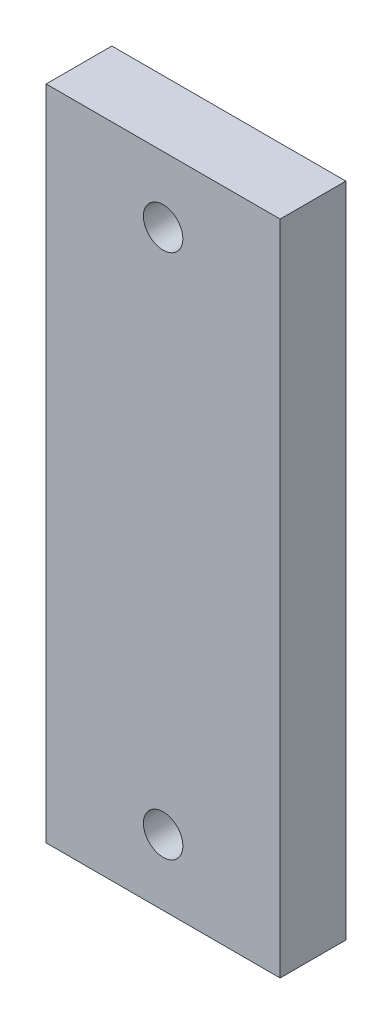
ISO-10303-21;
HEADER;
FILE_DESCRIPTION(('STEP AP214'),'2;1');
FILE_NAME('part.step','',(''),(''),'','','');
FILE_SCHEMA(('AUTOMOTIVE_DESIGN { 1 0 10303 214 1 1 1 1 }'));
ENDSEC;
DATA;
#1=APPLICATION_CONTEXT('core data for automotive mechanical design processes');
#2=APPLICATION_PROTOCOL_DEFINITION('international standard','automotive_design',2000,#1);
#3=PRODUCT_CONTEXT('',#1,'mechanical');
#4=PRODUCT('Part','Part','',(#3));
#5=PRODUCT_RELATED_PRODUCT_CATEGORY('part','',(#4));
#6=PRODUCT_DEFINITION_FORMATION('','',#4);
#7=PRODUCT_DEFINITION_CONTEXT('part definition',#1,'design');
#8=PRODUCT_DEFINITION('design','',#6,#7);
#9=PRODUCT_DEFINITION_SHAPE('','',#8);
#10=(LENGTH_UNIT() NAMED_UNIT(*) SI_UNIT(.MILLI.,.METRE.));
#11=(NAMED_UNIT(*) PLANE_ANGLE_UNIT() SI_UNIT($,.RADIAN.));
#12=(NAMED_UNIT(*) SI_UNIT($,.STERADIAN.) SOLID_ANGLE_UNIT());
#13=UNCERTAINTY_MEASURE_WITH_UNIT(LENGTH_MEASURE(1.E-05),#10,'distance_accuracy_value','');
#14=(GEOMETRIC_REPRESENTATION_CONTEXT(3) GLOBAL_UNCERTAINTY_ASSIGNED_CONTEXT((#13)) GLOBAL_UNIT_ASSIGNED_CONTEXT((#10,
#11,#12)) REPRESENTATION_CONTEXT('',''));
#15=CARTESIAN_POINT('',(0.,0.,0.));
#16=DIRECTION('',(0.,0.,1.));
#17=DIRECTION('',(1.,0.,0.));
#18=AXIS2_PLACEMENT_3D('',#15,#16,#17);
#19=CARTESIAN_POINT('',(0.,0.,5.));
#20=DIRECTION('',(0.,0.,-1.));
#21=DIRECTION('',(-1.,0.,0.));
#22=AXIS2_PLACEMENT_3D('',#19,#20,#21);
#23=PLANE('',#22);
#24=DIRECTION('',(0.,1.,0.));
#25=VECTOR('',#24,1.);
#26=CARTESIAN_POINT('',(8.9,-25.,5.));
#27=LINE('',#26,#25);
#28=CARTESIAN_POINT('',(8.9,-25.,5.));
#29=VERTEX_POINT('',#28);
#30=CARTESIAN_POINT('',(8.9,25.,5.));
#31=VERTEX_POINT('',#30);
#32=EDGE_CURVE('E98',#29,#31,#27,.T.);
#33=ORIENTED_EDGE('',*,*,#32,.T.);
#34=DIRECTION('',(-1.,0.,0.));
#35=VECTOR('',#34,1.);
#36=CARTESIAN_POINT('',(-8.9,25.,5.));
#37=LINE('',#36,#35);
#38=CARTESIAN_POINT('',(-8.9,25.,5.));
#39=VERTEX_POINT('',#38);
#40=EDGE_CURVE('E93',#31,#39,#37,.T.);
#41=ORIENTED_EDGE('',*,*,#40,.T.);
#42=DIRECTION('',(0.,-1.,0.));
#43=VECTOR('',#42,1.);
#44=CARTESIAN_POINT('',(-8.9,-25.,5.));
#45=LINE('',#44,#43);
#46=CARTESIAN_POINT('',(-8.9,-25.,5.));
#47=VERTEX_POINT('',#46);
#48=EDGE_CURVE('E96',#39,#47,#45,.T.);
#49=ORIENTED_EDGE('',*,*,#48,.T.);
#50=DIRECTION('',(1.,0.,0.));
#51=VECTOR('',#50,1.);
#52=CARTESIAN_POINT('',(-8.9,-25.,5.));
#53=LINE('',#52,#51);
#54=EDGE_CURVE('E63',#47,#29,#53,.T.);
#55=ORIENTED_EDGE('',*,*,#54,.T.);
#56=EDGE_LOOP('',(#33,#41,#49,#55));
#57=FACE_BOUND('',#56,.T.);
#58=CARTESIAN_POINT('',(0.,-20.,5.));
#59=DIRECTION('',(0.,0.,1.));
#60=DIRECTION('',(1.,0.,0.));
#61=AXIS2_PLACEMENT_3D('',#58,#59,#60);
#62=CIRCLE('',#61,1.5);
#63=CARTESIAN_POINT('',(1.5,-20.,5.));
#64=VERTEX_POINT('',#63);
#65=EDGE_CURVE('E118',#64,#64,#62,.T.);
#66=ORIENTED_EDGE('',*,*,#65,.F.);
#67=EDGE_LOOP('',(#66));
#68=FACE_BOUND('',#67,.T.);
#69=CARTESIAN_POINT('',(0.,20.,5.));
#70=DIRECTION('',(0.,0.,1.));
#71=DIRECTION('',(1.,0.,0.));
#72=AXIS2_PLACEMENT_3D('',#69,#70,#71);
#73=CIRCLE('',#72,1.5);
#74=CARTESIAN_POINT('',(1.5,20.,5.));
#75=VERTEX_POINT('',#74);
#76=EDGE_CURVE('E140',#75,#75,#73,.T.);
#77=ORIENTED_EDGE('',*,*,#76,.F.);
#78=EDGE_LOOP('',(#77));
#79=FACE_BOUND('',#78,.T.);
#80=ADVANCED_FACE('F45',(#57,#68,#79),#23,.F.);
#81=CARTESIAN_POINT('',(0.,0.,0.));
#82=DIRECTION('',(0.,0.,-1.));
#83=DIRECTION('',(-1.,0.,0.));
#84=AXIS2_PLACEMENT_3D('',#81,#82,#83);
#85=PLANE('',#84);
#86=CARTESIAN_POINT('',(0.,-20.,0.));
#87=DIRECTION('',(0.,0.,1.));
#88=DIRECTION('',(1.,0.,0.));
#89=AXIS2_PLACEMENT_3D('',#86,#87,#88);
#90=CIRCLE('',#89,1.5);
#91=CARTESIAN_POINT('',(1.5,-20.,0.));
#92=VERTEX_POINT('',#91);
#93=EDGE_CURVE('E136',#92,#92,#90,.T.);
#94=ORIENTED_EDGE('',*,*,#93,.T.);
#95=EDGE_LOOP('',(#94));
#96=FACE_BOUND('',#95,.T.);
#97=DIRECTION('',(0.,1.,0.));
#98=VECTOR('',#97,1.);
#99=CARTESIAN_POINT('',(8.9,-25.,0.));
#100=LINE('',#99,#98);
#101=CARTESIAN_POINT('',(8.9,-25.,0.));
#102=VERTEX_POINT('',#101);
#103=CARTESIAN_POINT('',(8.9,25.,0.));
#104=VERTEX_POINT('',#103);
#105=EDGE_CURVE('E114',#102,#104,#100,.T.);
#106=ORIENTED_EDGE('',*,*,#105,.F.);
#107=DIRECTION('',(1.,0.,0.));
#108=VECTOR('',#107,1.);
#109=CARTESIAN_POINT('',(-8.9,-25.,0.));
#110=LINE('',#109,#108);
#111=CARTESIAN_POINT('',(-8.9,-25.,0.));
#112=VERTEX_POINT('',#111);
#113=EDGE_CURVE('E86',#112,#102,#110,.T.);
#114=ORIENTED_EDGE('',*,*,#113,.F.);
#115=DIRECTION('',(0.,-1.,0.));
#116=VECTOR('',#115,1.);
#117=CARTESIAN_POINT('',(-8.9,-25.,0.));
#118=LINE('',#117,#116);
#119=CARTESIAN_POINT('',(-8.9,25.,0.));
#120=VERTEX_POINT('',#119);
#121=EDGE_CURVE('E80',#120,#112,#118,.T.);
#122=ORIENTED_EDGE('',*,*,#121,.F.);
#123=DIRECTION('',(-1.,0.,0.));
#124=VECTOR('',#123,1.);
#125=CARTESIAN_POINT('',(-8.9,25.,0.));
#126=LINE('',#125,#124);
#127=EDGE_CURVE('E103',#104,#120,#126,.T.);
#128=ORIENTED_EDGE('',*,*,#127,.F.);
#129=EDGE_LOOP('',(#106,#114,#122,#128));
#130=FACE_BOUND('',#129,.T.);
#131=CARTESIAN_POINT('',(0.,20.,0.));
#132=DIRECTION('',(0.,0.,1.));
#133=DIRECTION('',(1.,0.,0.));
#134=AXIS2_PLACEMENT_3D('',#131,#132,#133);
#135=CIRCLE('',#134,1.5);
#136=CARTESIAN_POINT('',(1.5,20.,0.));
#137=VERTEX_POINT('',#136);
#138=EDGE_CURVE('E144',#137,#137,#135,.T.);
#139=ORIENTED_EDGE('',*,*,#138,.T.);
#140=EDGE_LOOP('',(#139));
#141=FACE_BOUND('',#140,.T.);
#142=ADVANCED_FACE('F131',(#96,#130,#141),#85,.T.);
#143=CARTESIAN_POINT('',(8.9,-25.,5.));
#144=DIRECTION('',(-1.,0.,0.));
#145=DIRECTION('',(0.,0.,1.));
#146=AXIS2_PLACEMENT_3D('',#143,#144,#145);
#147=PLANE('',#146);
#148=ORIENTED_EDGE('',*,*,#105,.T.);
#149=DIRECTION('',(0.,0.,-1.));
#150=VECTOR('',#149,1.);
#151=CARTESIAN_POINT('',(8.9,25.,5.));
#152=LINE('',#151,#150);
#153=EDGE_CURVE('E11',#31,#104,#152,.T.);
#154=ORIENTED_EDGE('',*,*,#153,.F.);
#155=ORIENTED_EDGE('',*,*,#32,.F.);
#156=DIRECTION('',(0.,0.,-1.));
#157=VECTOR('',#156,1.);
#158=CARTESIAN_POINT('',(8.9,-25.,5.));
#159=LINE('',#158,#157);
#160=EDGE_CURVE('E110',#29,#102,#159,.T.);
#161=ORIENTED_EDGE('',*,*,#160,.T.);
#162=EDGE_LOOP('',(#148,#154,#155,#161));
#163=FACE_BOUND('',#162,.T.);
#164=ADVANCED_FACE('F47',(#163),#147,.F.);
#165=CARTESIAN_POINT('',(-8.9,25.,5.));
#166=DIRECTION('',(0.,-1.,0.));
#167=DIRECTION('',(0.,0.,-1.));
#168=AXIS2_PLACEMENT_3D('',#165,#166,#167);
#169=PLANE('',#168);
#170=ORIENTED_EDGE('',*,*,#127,.T.);
#171=DIRECTION('',(0.,0.,-1.));
#172=VECTOR('',#171,1.);
#173=CARTESIAN_POINT('',(-8.9,25.,5.));
#174=LINE('',#173,#172);
#175=EDGE_CURVE('E55',#39,#120,#174,.T.);
#176=ORIENTED_EDGE('',*,*,#175,.F.);
#177=ORIENTED_EDGE('',*,*,#40,.F.);
#178=ORIENTED_EDGE('',*,*,#153,.T.);
#179=EDGE_LOOP('',(#170,#176,#177,#178));
#180=FACE_BOUND('',#179,.T.);
#181=ADVANCED_FACE('F102',(#180),#169,.F.);
#182=CARTESIAN_POINT('',(-8.9,-25.,5.));
#183=DIRECTION('',(1.,0.,0.));
#184=DIRECTION('',(0.,0.,-1.));
#185=AXIS2_PLACEMENT_3D('',#182,#183,#184);
#186=PLANE('',#185);
#187=ORIENTED_EDGE('',*,*,#121,.T.);
#188=DIRECTION('',(0.,0.,-1.));
#189=VECTOR('',#188,1.);
#190=CARTESIAN_POINT('',(-8.9,-25.,5.));
#191=LINE('',#190,#189);
#192=EDGE_CURVE('E105',#47,#112,#191,.T.);
#193=ORIENTED_EDGE('',*,*,#192,.F.);
#194=ORIENTED_EDGE('',*,*,#48,.F.);
#195=ORIENTED_EDGE('',*,*,#175,.T.);
#196=EDGE_LOOP('',(#187,#193,#194,#195));
#197=FACE_BOUND('',#196,.T.);
#198=ADVANCED_FACE('F106',(#197),#186,.F.);
#199=CARTESIAN_POINT('',(-8.9,-25.,5.));
#200=DIRECTION('',(0.,1.,0.));
#201=DIRECTION('',(0.,0.,1.));
#202=AXIS2_PLACEMENT_3D('',#199,#200,#201);
#203=PLANE('',#202);
#204=ORIENTED_EDGE('',*,*,#113,.T.);
#205=ORIENTED_EDGE('',*,*,#160,.F.);
#206=ORIENTED_EDGE('',*,*,#54,.F.);
#207=ORIENTED_EDGE('',*,*,#192,.T.);
#208=EDGE_LOOP('',(#204,#205,#206,#207));
#209=FACE_BOUND('',#208,.T.);
#210=ADVANCED_FACE('F128',(#209),#203,.F.);
#211=CARTESIAN_POINT('',(0.,-20.,5.));
#212=DIRECTION('',(0.,0.,-1.));
#213=DIRECTION('',(-1.,0.,0.));
#214=AXIS2_PLACEMENT_3D('',#211,#212,#213);
#215=CYLINDRICAL_SURFACE('',#214,1.5);
#216=ORIENTED_EDGE('',*,*,#65,.T.);
#217=EDGE_LOOP('',(#216));
#218=FACE_BOUND('',#217,.T.);
#219=ORIENTED_EDGE('',*,*,#93,.F.);
#220=EDGE_LOOP('',(#219));
#221=FACE_BOUND('',#220,.T.);
#222=ADVANCED_FACE('F163',(#218,#221),#215,.F.);
#223=CARTESIAN_POINT('',(0.,20.,5.));
#224=DIRECTION('',(0.,0.,-1.));
#225=DIRECTION('',(-1.,0.,0.));
#226=AXIS2_PLACEMENT_3D('',#223,#224,#225);
#227=CYLINDRICAL_SURFACE('',#226,1.5);
#228=ORIENTED_EDGE('',*,*,#76,.T.);
#229=EDGE_LOOP('',(#228));
#230=FACE_BOUND('',#229,.T.);
#231=ORIENTED_EDGE('',*,*,#138,.F.);
#232=EDGE_LOOP('',(#231));
#233=FACE_BOUND('',#232,.T.);
#234=ADVANCED_FACE('F152',(#230,#233),#227,.F.);
#235=CLOSED_SHELL('',(#80,#142,#164,#181,#198,#210,#222,#234));
#236=MANIFOLD_SOLID_BREP('B2',#235);
#237=ADVANCED_BREP_SHAPE_REPRESENTATION('',(#18,#236),#14);
#238=SHAPE_DEFINITION_REPRESENTATION(#9,#237);
ENDSEC;
END-ISO-10303-21;
